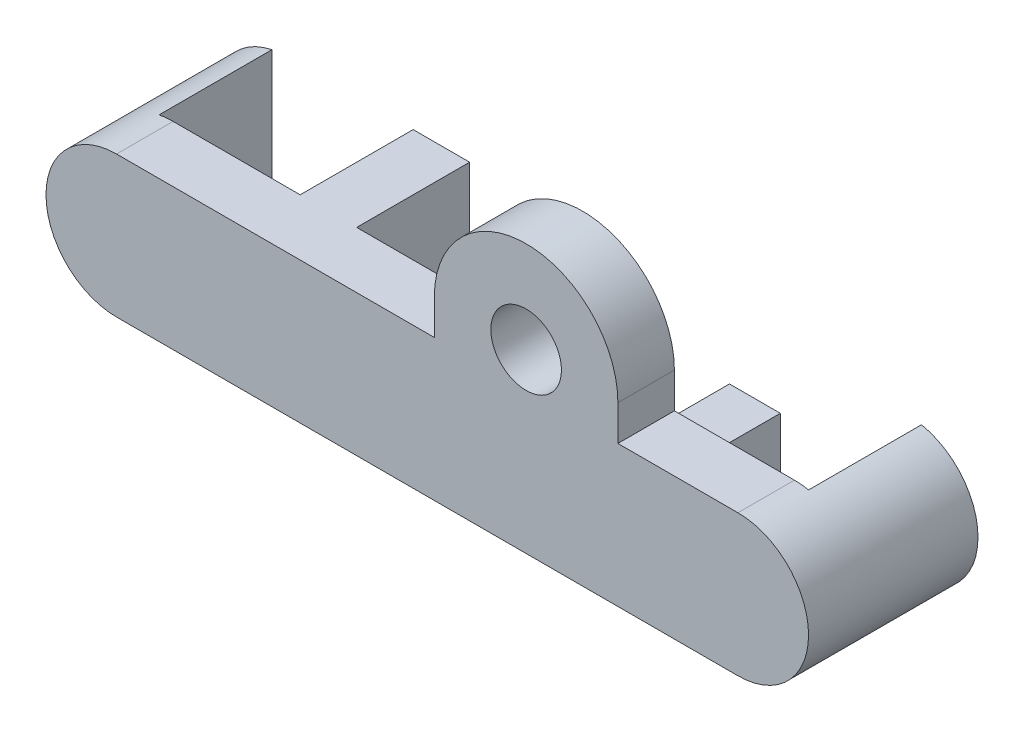
ISO-10303-21;
HEADER;
FILE_DESCRIPTION(('STEP AP214'),'2;1');
FILE_NAME('part.step','',(''),(''),'','','');
FILE_SCHEMA(('AUTOMOTIVE_DESIGN { 1 0 10303 214 1 1 1 1 }'));
ENDSEC;
DATA;
#1=APPLICATION_CONTEXT('core data for automotive mechanical design processes');
#2=APPLICATION_PROTOCOL_DEFINITION('international standard','automotive_design',2000,#1);
#3=PRODUCT_CONTEXT('',#1,'mechanical');
#4=PRODUCT('Part','Part','',(#3));
#5=PRODUCT_RELATED_PRODUCT_CATEGORY('part','',(#4));
#6=PRODUCT_DEFINITION_FORMATION('','',#4);
#7=PRODUCT_DEFINITION_CONTEXT('part definition',#1,'design');
#8=PRODUCT_DEFINITION('design','',#6,#7);
#9=PRODUCT_DEFINITION_SHAPE('','',#8);
#10=(LENGTH_UNIT() NAMED_UNIT(*) SI_UNIT(.MILLI.,.METRE.));
#11=(NAMED_UNIT(*) PLANE_ANGLE_UNIT() SI_UNIT($,.RADIAN.));
#12=(NAMED_UNIT(*) SI_UNIT($,.STERADIAN.) SOLID_ANGLE_UNIT());
#13=UNCERTAINTY_MEASURE_WITH_UNIT(LENGTH_MEASURE(1.E-05),#10,'distance_accuracy_value','');
#14=(GEOMETRIC_REPRESENTATION_CONTEXT(3) GLOBAL_UNCERTAINTY_ASSIGNED_CONTEXT((#13)) GLOBAL_UNIT_ASSIGNED_CONTEXT((#10,
#11,#12)) REPRESENTATION_CONTEXT('',''));
#15=CARTESIAN_POINT('',(0.,0.,0.));
#16=DIRECTION('',(0.,0.,1.));
#17=DIRECTION('',(1.,0.,0.));
#18=AXIS2_PLACEMENT_3D('',#15,#16,#17);
#19=CARTESIAN_POINT('',(-14.5,-3.75,-2.));
#20=DIRECTION('',(0.,0.,-1.));
#21=DIRECTION('',(1.,0.,0.));
#22=AXIS2_PLACEMENT_3D('',#19,#20,#21);
#23=PLANE('',#22);
#24=DIRECTION('',(1.,0.,0.));
#25=VECTOR('',#24,1.);
#26=CARTESIAN_POINT('',(-14.5,-6.25,-2.));
#27=LINE('',#26,#25);
#28=CARTESIAN_POINT('',(-14.5,-6.25,-2.));
#29=VERTEX_POINT('',#28);
#30=CARTESIAN_POINT('',(-10.,-6.25,-2.));
#31=VERTEX_POINT('',#30);
#32=EDGE_CURVE('E377',#29,#31,#27,.T.);
#33=ORIENTED_EDGE('',*,*,#32,.F.);
#34=CARTESIAN_POINT('',(-14.5,-3.75,-2.));
#35=DIRECTION('',(0.,0.,1.));
#36=DIRECTION('',(1.,0.,0.));
#37=AXIS2_PLACEMENT_3D('',#34,#35,#36);
#38=CIRCLE('',#37,2.5);
#39=CARTESIAN_POINT('',(-15.,-6.19948974278318,-2.));
#40=VERTEX_POINT('',#39);
#41=EDGE_CURVE('E376',#40,#29,#38,.T.);
#42=ORIENTED_EDGE('',*,*,#41,.F.);
#43=DIRECTION('',(0.,-1.,0.));
#44=VECTOR('',#43,1.);
#45=CARTESIAN_POINT('',(-15.,0.,-2.));
#46=LINE('',#45,#44);
#47=CARTESIAN_POINT('',(-15.,-1.30051025721682,-2.));
#48=VERTEX_POINT('',#47);
#49=EDGE_CURVE('E227',#48,#40,#46,.T.);
#50=ORIENTED_EDGE('',*,*,#49,.F.);
#51=CARTESIAN_POINT('',(-14.5,-1.25,-2.));
#52=VERTEX_POINT('',#51);
#53=EDGE_CURVE('E371',#52,#48,#38,.T.);
#54=ORIENTED_EDGE('',*,*,#53,.F.);
#55=DIRECTION('',(-1.,0.,0.));
#56=VECTOR('',#55,1.);
#57=CARTESIAN_POINT('',(-14.5,-1.25,-2.));
#58=LINE('',#57,#56);
#59=CARTESIAN_POINT('',(-10.,-1.25,-2.));
#60=VERTEX_POINT('',#59);
#61=EDGE_CURVE('E404',#60,#52,#58,.T.);
#62=ORIENTED_EDGE('',*,*,#61,.F.);
#63=DIRECTION('',(0.,-1.,0.));
#64=VECTOR('',#63,1.);
#65=CARTESIAN_POINT('',(-10.,0.,-2.));
#66=LINE('',#65,#64);
#67=EDGE_CURVE('E222',#60,#31,#66,.T.);
#68=ORIENTED_EDGE('',*,*,#67,.T.);
#69=EDGE_LOOP('',(#33,#42,#50,#54,#62,#68));
#70=FACE_BOUND('',#69,.T.);
#71=ADVANCED_FACE('F47',(#70),#23,.T.);
#72=DIRECTION('',(0.,-1.,0.));
#73=VECTOR('',#72,1.);
#74=CARTESIAN_POINT('',(-8.,0.,-2.));
#75=LINE('',#74,#73);
#76=CARTESIAN_POINT('',(-8.,-1.25,-2.));
#77=VERTEX_POINT('',#76);
#78=CARTESIAN_POINT('',(-8.,-6.25,-2.));
#79=VERTEX_POINT('',#78);
#80=EDGE_CURVE('E234',#77,#79,#75,.T.);
#81=ORIENTED_EDGE('',*,*,#80,.F.);
#82=CARTESIAN_POINT('',(-3.25,-1.25,-2.));
#83=VERTEX_POINT('',#82);
#84=EDGE_CURVE('E405',#83,#77,#58,.T.);
#85=ORIENTED_EDGE('',*,*,#84,.F.);
#86=DIRECTION('',(0.,-1.,0.));
#87=VECTOR('',#86,1.);
#88=CARTESIAN_POINT('',(-3.25,0.,-2.));
#89=LINE('',#88,#87);
#90=CARTESIAN_POINT('',(-3.25,0.,-2.));
#91=VERTEX_POINT('',#90);
#92=EDGE_CURVE('E400',#91,#83,#89,.T.);
#93=ORIENTED_EDGE('',*,*,#92,.F.);
#94=CARTESIAN_POINT('',(0.,0.,-2.));
#95=DIRECTION('',(0.,0.,1.));
#96=DIRECTION('',(1.,0.,0.));
#97=AXIS2_PLACEMENT_3D('',#94,#95,#96);
#98=CIRCLE('',#97,3.25);
#99=CARTESIAN_POINT('',(3.25,0.,-2.));
#100=VERTEX_POINT('',#99);
#101=EDGE_CURVE('E396',#100,#91,#98,.T.);
#102=ORIENTED_EDGE('',*,*,#101,.F.);
#103=DIRECTION('',(0.,1.,0.));
#104=VECTOR('',#103,1.);
#105=CARTESIAN_POINT('',(3.25,0.,-2.));
#106=LINE('',#105,#104);
#107=CARTESIAN_POINT('',(3.25,-1.25,-2.));
#108=VERTEX_POINT('',#107);
#109=EDGE_CURVE('E392',#108,#100,#106,.T.);
#110=ORIENTED_EDGE('',*,*,#109,.F.);
#111=DIRECTION('',(-1.,0.,0.));
#112=VECTOR('',#111,1.);
#113=CARTESIAN_POINT('',(3.25,-1.25,-2.));
#114=LINE('',#113,#112);
#115=CARTESIAN_POINT('',(7.5,-1.25,-2.));
#116=VERTEX_POINT('',#115);
#117=EDGE_CURVE('E388',#116,#108,#114,.T.);
#118=ORIENTED_EDGE('',*,*,#117,.F.);
#119=CARTESIAN_POINT('',(7.5,-3.75,-2.));
#120=DIRECTION('',(0.,0.,1.));
#121=DIRECTION('',(1.,0.,0.));
#122=AXIS2_PLACEMENT_3D('',#119,#120,#121);
#123=CIRCLE('',#122,2.5);
#124=CARTESIAN_POINT('',(8.,-1.30051025721682,-2.));
#125=VERTEX_POINT('',#124);
#126=EDGE_CURVE('E381',#125,#116,#123,.T.);
#127=ORIENTED_EDGE('',*,*,#126,.F.);
#128=DIRECTION('',(0.,-1.,0.));
#129=VECTOR('',#128,1.);
#130=CARTESIAN_POINT('',(8.,0.,-2.));
#131=LINE('',#130,#129);
#132=CARTESIAN_POINT('',(8.,-6.19948974278318,-2.));
#133=VERTEX_POINT('',#132);
#134=EDGE_CURVE('E270',#125,#133,#131,.T.);
#135=ORIENTED_EDGE('',*,*,#134,.T.);
#136=CARTESIAN_POINT('',(7.5,-6.25,-2.));
#137=VERTEX_POINT('',#136);
#138=EDGE_CURVE('E384',#137,#133,#123,.T.);
#139=ORIENTED_EDGE('',*,*,#138,.F.);
#140=CARTESIAN_POINT('',(3.,-6.25,-2.));
#141=VERTEX_POINT('',#140);
#142=EDGE_CURVE('E375',#141,#137,#27,.T.);
#143=ORIENTED_EDGE('',*,*,#142,.F.);
#144=DIRECTION('',(0.,-1.,0.));
#145=VECTOR('',#144,1.);
#146=CARTESIAN_POINT('',(3.,0.,-2.));
#147=LINE('',#146,#145);
#148=CARTESIAN_POINT('',(3.,-3.45,-2.));
#149=VERTEX_POINT('',#148);
#150=EDGE_CURVE('E293',#149,#141,#147,.T.);
#151=ORIENTED_EDGE('',*,*,#150,.F.);
#152=DIRECTION('',(1.,0.,0.));
#153=VECTOR('',#152,1.);
#154=CARTESIAN_POINT('',(0.,-3.45,-2.));
#155=LINE('',#154,#153);
#156=CARTESIAN_POINT('',(1.2,-3.45,-2.));
#157=VERTEX_POINT('',#156);
#158=EDGE_CURVE('E287',#157,#149,#155,.T.);
#159=ORIENTED_EDGE('',*,*,#158,.F.);
#160=DIRECTION('',(0.,-1.,0.));
#161=VECTOR('',#160,1.);
#162=CARTESIAN_POINT('',(1.2,0.,-2.));
#163=LINE('',#162,#161);
#164=CARTESIAN_POINT('',(1.2,-6.25,-2.));
#165=VERTEX_POINT('',#164);
#166=EDGE_CURVE('E307',#157,#165,#163,.T.);
#167=ORIENTED_EDGE('',*,*,#166,.T.);
#168=CARTESIAN_POINT('',(-1.2,-6.25,-2.));
#169=VERTEX_POINT('',#168);
#170=EDGE_CURVE('E383',#169,#165,#27,.T.);
#171=ORIENTED_EDGE('',*,*,#170,.F.);
#172=DIRECTION('',(0.,-1.,0.));
#173=VECTOR('',#172,1.);
#174=CARTESIAN_POINT('',(-1.2,0.,-2.));
#175=LINE('',#174,#173);
#176=CARTESIAN_POINT('',(-1.2,-3.45,-2.));
#177=VERTEX_POINT('',#176);
#178=EDGE_CURVE('E325',#177,#169,#175,.T.);
#179=ORIENTED_EDGE('',*,*,#178,.F.);
#180=DIRECTION('',(1.,0.,0.));
#181=VECTOR('',#180,1.);
#182=CARTESIAN_POINT('',(0.,-3.45,-2.));
#183=LINE('',#182,#181);
#184=CARTESIAN_POINT('',(-3.,-3.45,-2.));
#185=VERTEX_POINT('',#184);
#186=EDGE_CURVE('E344',#185,#177,#183,.T.);
#187=ORIENTED_EDGE('',*,*,#186,.F.);
#188=DIRECTION('',(0.,-1.,0.));
#189=VECTOR('',#188,1.);
#190=CARTESIAN_POINT('',(-3.,0.,-2.));
#191=LINE('',#190,#189);
#192=CARTESIAN_POINT('',(-3.,-6.25,-2.));
#193=VERTEX_POINT('',#192);
#194=EDGE_CURVE('E330',#185,#193,#191,.T.);
#195=ORIENTED_EDGE('',*,*,#194,.T.);
#196=EDGE_CURVE('E382',#79,#193,#27,.T.);
#197=ORIENTED_EDGE('',*,*,#196,.F.);
#198=EDGE_LOOP('',(#81,#85,#93,#102,#110,#118,#127,#135,#139,#143,#151,#159,#167,#171,#179,#187,
#195,#197));
#199=FACE_BOUND('',#198,.T.);
#200=CARTESIAN_POINT('',(0.,0.,-2.));
#201=DIRECTION('',(0.,0.,1.));
#202=DIRECTION('',(1.,0.,0.));
#203=AXIS2_PLACEMENT_3D('',#200,#201,#202);
#204=CIRCLE('',#203,1.25);
#205=CARTESIAN_POINT('',(1.25,0.,-2.));
#206=VERTEX_POINT('',#205);
#207=EDGE_CURVE('E363',#206,#206,#204,.T.);
#208=ORIENTED_EDGE('',*,*,#207,.T.);
#209=EDGE_LOOP('',(#208));
#210=FACE_BOUND('',#209,.T.);
#211=ADVANCED_FACE('F491',(#199,#210),#23,.T.);
#212=CARTESIAN_POINT('',(-14.5,-3.75,0.));
#213=DIRECTION('',(0.,0.,-1.));
#214=DIRECTION('',(1.,0.,0.));
#215=AXIS2_PLACEMENT_3D('',#212,#213,#214);
#216=PLANE('',#215);
#217=CARTESIAN_POINT('',(-14.5,-3.75,0.));
#218=DIRECTION('',(0.,0.,1.));
#219=DIRECTION('',(1.,0.,0.));
#220=AXIS2_PLACEMENT_3D('',#217,#218,#219);
#221=CIRCLE('',#220,2.5);
#222=CARTESIAN_POINT('',(-14.5,-1.25,0.));
#223=VERTEX_POINT('',#222);
#224=CARTESIAN_POINT('',(-14.5,-6.25,0.));
#225=VERTEX_POINT('',#224);
#226=EDGE_CURVE('E367',#223,#225,#221,.T.);
#227=ORIENTED_EDGE('',*,*,#226,.T.);
#228=DIRECTION('',(1.,0.,0.));
#229=VECTOR('',#228,1.);
#230=CARTESIAN_POINT('',(-14.5,-6.25,0.));
#231=LINE('',#230,#229);
#232=CARTESIAN_POINT('',(7.5,-6.25,0.));
#233=VERTEX_POINT('',#232);
#234=EDGE_CURVE('E412',#225,#233,#231,.T.);
#235=ORIENTED_EDGE('',*,*,#234,.T.);
#236=CARTESIAN_POINT('',(7.5,-3.75,0.));
#237=DIRECTION('',(0.,0.,1.));
#238=DIRECTION('',(1.,0.,0.));
#239=AXIS2_PLACEMENT_3D('',#236,#237,#238);
#240=CIRCLE('',#239,2.5);
#241=CARTESIAN_POINT('',(7.5,-1.25,0.));
#242=VERTEX_POINT('',#241);
#243=EDGE_CURVE('E416',#233,#242,#240,.T.);
#244=ORIENTED_EDGE('',*,*,#243,.T.);
#245=DIRECTION('',(-1.,0.,0.));
#246=VECTOR('',#245,1.);
#247=CARTESIAN_POINT('',(3.25,-1.25,0.));
#248=LINE('',#247,#246);
#249=CARTESIAN_POINT('',(3.25,-1.25,0.));
#250=VERTEX_POINT('',#249);
#251=EDGE_CURVE('E420',#242,#250,#248,.T.);
#252=ORIENTED_EDGE('',*,*,#251,.T.);
#253=DIRECTION('',(0.,1.,0.));
#254=VECTOR('',#253,1.);
#255=CARTESIAN_POINT('',(3.25,0.,0.));
#256=LINE('',#255,#254);
#257=CARTESIAN_POINT('',(3.25,0.,0.));
#258=VERTEX_POINT('',#257);
#259=EDGE_CURVE('E424',#250,#258,#256,.T.);
#260=ORIENTED_EDGE('',*,*,#259,.T.);
#261=CARTESIAN_POINT('',(0.,0.,0.));
#262=DIRECTION('',(0.,0.,1.));
#263=DIRECTION('',(1.,0.,0.));
#264=AXIS2_PLACEMENT_3D('',#261,#262,#263);
#265=CIRCLE('',#264,3.25);
#266=CARTESIAN_POINT('',(-3.25,0.,0.));
#267=VERTEX_POINT('',#266);
#268=EDGE_CURVE('E428',#258,#267,#265,.T.);
#269=ORIENTED_EDGE('',*,*,#268,.T.);
#270=DIRECTION('',(0.,-1.,0.));
#271=VECTOR('',#270,1.);
#272=CARTESIAN_POINT('',(-3.25,0.,0.));
#273=LINE('',#272,#271);
#274=CARTESIAN_POINT('',(-3.25,-1.25,0.));
#275=VERTEX_POINT('',#274);
#276=EDGE_CURVE('E431',#267,#275,#273,.T.);
#277=ORIENTED_EDGE('',*,*,#276,.T.);
#278=DIRECTION('',(-1.,0.,0.));
#279=VECTOR('',#278,1.);
#280=CARTESIAN_POINT('',(-14.5,-1.25,0.));
#281=LINE('',#280,#279);
#282=EDGE_CURVE('E435',#275,#223,#281,.T.);
#283=ORIENTED_EDGE('',*,*,#282,.T.);
#284=EDGE_LOOP('',(#227,#235,#244,#252,#260,#269,#277,#283));
#285=FACE_BOUND('',#284,.T.);
#286=CARTESIAN_POINT('',(0.,0.,0.));
#287=DIRECTION('',(0.,0.,1.));
#288=DIRECTION('',(1.,0.,0.));
#289=AXIS2_PLACEMENT_3D('',#286,#287,#288);
#290=CIRCLE('',#289,1.25);
#291=CARTESIAN_POINT('',(1.25,0.,0.));
#292=VERTEX_POINT('',#291);
#293=EDGE_CURVE('E362',#292,#292,#290,.T.);
#294=ORIENTED_EDGE('',*,*,#293,.F.);
#295=EDGE_LOOP('',(#294));
#296=FACE_BOUND('',#295,.T.);
#297=ADVANCED_FACE('F467',(#285,#296),#216,.F.);
#298=CARTESIAN_POINT('',(-14.5,-3.75,-2.));
#299=DIRECTION('',(0.,0.,1.));
#300=DIRECTION('',(-1.,0.,0.));
#301=AXIS2_PLACEMENT_3D('',#298,#299,#300);
#302=CYLINDRICAL_SURFACE('',#301,2.5);
#303=ORIENTED_EDGE('',*,*,#226,.F.);
#304=DIRECTION('',(0.,0.,1.));
#305=VECTOR('',#304,1.);
#306=CARTESIAN_POINT('',(-14.5,-1.25,-2.));
#307=LINE('',#306,#305);
#308=EDGE_CURVE('E408',#52,#223,#307,.T.);
#309=ORIENTED_EDGE('',*,*,#308,.F.);
#310=ORIENTED_EDGE('',*,*,#53,.T.);
#311=DIRECTION('',(0.,0.,1.));
#312=VECTOR('',#311,1.);
#313=CARTESIAN_POINT('',(-15.,-1.30051025721682,-6.));
#314=LINE('',#313,#312);
#315=CARTESIAN_POINT('',(-15.,-1.30051025721682,-6.));
#316=VERTEX_POINT('',#315);
#317=EDGE_CURVE('E267',#316,#48,#314,.T.);
#318=ORIENTED_EDGE('',*,*,#317,.F.);
#319=CARTESIAN_POINT('',(-14.5,-3.75,-6.));
#320=DIRECTION('',(0.,0.,1.));
#321=DIRECTION('',(1.,0.,0.));
#322=AXIS2_PLACEMENT_3D('',#319,#320,#321);
#323=CIRCLE('',#322,2.5);
#324=CARTESIAN_POINT('',(-15.,-6.19948974278318,-6.));
#325=VERTEX_POINT('',#324);
#326=EDGE_CURVE('E257',#316,#325,#323,.T.);
#327=ORIENTED_EDGE('',*,*,#326,.T.);
#328=DIRECTION('',(0.,0.,1.));
#329=VECTOR('',#328,1.);
#330=CARTESIAN_POINT('',(-15.,-6.19948974278318,-6.));
#331=LINE('',#330,#329);
#332=EDGE_CURVE('E261',#325,#40,#331,.T.);
#333=ORIENTED_EDGE('',*,*,#332,.T.);
#334=ORIENTED_EDGE('',*,*,#41,.T.);
#335=DIRECTION('',(0.,0.,1.));
#336=VECTOR('',#335,1.);
#337=CARTESIAN_POINT('',(-14.5,-6.25,-2.));
#338=LINE('',#337,#336);
#339=EDGE_CURVE('E11',#29,#225,#338,.T.);
#340=ORIENTED_EDGE('',*,*,#339,.T.);
#341=EDGE_LOOP('',(#303,#309,#310,#318,#327,#333,#334,#340));
#342=FACE_BOUND('',#341,.T.);
#343=ADVANCED_FACE('F49',(#342),#302,.T.);
#344=CARTESIAN_POINT('',(-14.5,-6.25,-2.));
#345=DIRECTION('',(0.,1.,0.));
#346=DIRECTION('',(0.,0.,-1.));
#347=AXIS2_PLACEMENT_3D('',#344,#345,#346);
#348=PLANE('',#347);
#349=ORIENTED_EDGE('',*,*,#234,.F.);
#350=ORIENTED_EDGE('',*,*,#339,.F.);
#351=ORIENTED_EDGE('',*,*,#32,.T.);
#352=DIRECTION('',(0.,0.,1.));
#353=VECTOR('',#352,1.);
#354=CARTESIAN_POINT('',(-10.,-6.25,-6.));
#355=LINE('',#354,#353);
#356=CARTESIAN_POINT('',(-10.,-6.25,-6.));
#357=VERTEX_POINT('',#356);
#358=EDGE_CURVE('E71',#357,#31,#355,.T.);
#359=ORIENTED_EDGE('',*,*,#358,.F.);
#360=DIRECTION('',(1.,0.,0.));
#361=VECTOR('',#360,1.);
#362=CARTESIAN_POINT('',(0.,-6.25,-6.));
#363=LINE('',#362,#361);
#364=CARTESIAN_POINT('',(-8.,-6.25,-6.));
#365=VERTEX_POINT('',#364);
#366=EDGE_CURVE('E217',#357,#365,#363,.T.);
#367=ORIENTED_EDGE('',*,*,#366,.T.);
#368=DIRECTION('',(0.,0.,1.));
#369=VECTOR('',#368,1.);
#370=CARTESIAN_POINT('',(-8.,-6.25,-6.));
#371=LINE('',#370,#369);
#372=EDGE_CURVE('E63',#365,#79,#371,.T.);
#373=ORIENTED_EDGE('',*,*,#372,.T.);
#374=ORIENTED_EDGE('',*,*,#196,.T.);
#375=DIRECTION('',(0.,0.,1.));
#376=VECTOR('',#375,1.);
#377=CARTESIAN_POINT('',(-3.,-6.25,-6.));
#378=LINE('',#377,#376);
#379=CARTESIAN_POINT('',(-3.,-6.25,-6.));
#380=VERTEX_POINT('',#379);
#381=EDGE_CURVE('E353',#380,#193,#378,.T.);
#382=ORIENTED_EDGE('',*,*,#381,.F.);
#383=DIRECTION('',(1.,0.,0.));
#384=VECTOR('',#383,1.);
#385=CARTESIAN_POINT('',(0.,-6.25,-6.));
#386=LINE('',#385,#384);
#387=CARTESIAN_POINT('',(-1.2,-6.25,-6.));
#388=VERTEX_POINT('',#387);
#389=EDGE_CURVE('E336',#380,#388,#386,.T.);
#390=ORIENTED_EDGE('',*,*,#389,.T.);
#391=DIRECTION('',(0.,0.,1.));
#392=VECTOR('',#391,1.);
#393=CARTESIAN_POINT('',(-1.2,-6.25,-6.));
#394=LINE('',#393,#392);
#395=EDGE_CURVE('E340',#388,#169,#394,.T.);
#396=ORIENTED_EDGE('',*,*,#395,.T.);
#397=ORIENTED_EDGE('',*,*,#170,.T.);
#398=DIRECTION('',(0.,0.,1.));
#399=VECTOR('',#398,1.);
#400=CARTESIAN_POINT('',(1.2,-6.25,-6.));
#401=LINE('',#400,#399);
#402=CARTESIAN_POINT('',(1.2,-6.25,-6.));
#403=VERTEX_POINT('',#402);
#404=EDGE_CURVE('E319',#403,#165,#401,.T.);
#405=ORIENTED_EDGE('',*,*,#404,.F.);
#406=DIRECTION('',(1.,0.,0.));
#407=VECTOR('',#406,1.);
#408=CARTESIAN_POINT('',(0.,-6.25,-6.));
#409=LINE('',#408,#407);
#410=CARTESIAN_POINT('',(3.,-6.25,-6.));
#411=VERTEX_POINT('',#410);
#412=EDGE_CURVE('E296',#403,#411,#409,.T.);
#413=ORIENTED_EDGE('',*,*,#412,.T.);
#414=DIRECTION('',(0.,0.,1.));
#415=VECTOR('',#414,1.);
#416=CARTESIAN_POINT('',(3.,-6.25,-6.));
#417=LINE('',#416,#415);
#418=EDGE_CURVE('E316',#411,#141,#417,.T.);
#419=ORIENTED_EDGE('',*,*,#418,.T.);
#420=ORIENTED_EDGE('',*,*,#142,.T.);
#421=DIRECTION('',(0.,0.,1.));
#422=VECTOR('',#421,1.);
#423=CARTESIAN_POINT('',(7.5,-6.25,-2.));
#424=LINE('',#423,#422);
#425=EDGE_CURVE('E56',#137,#233,#424,.T.);
#426=ORIENTED_EDGE('',*,*,#425,.T.);
#427=EDGE_LOOP('',(#349,#350,#351,#359,#367,#373,#374,#382,#390,#396,#397,#405,#413,#419,#420,#426));
#428=FACE_BOUND('',#427,.T.);
#429=ADVANCED_FACE('F459',(#428),#348,.F.);
#430=CARTESIAN_POINT('',(7.5,-3.75,-2.));
#431=DIRECTION('',(0.,0.,1.));
#432=DIRECTION('',(-1.,0.,0.));
#433=AXIS2_PLACEMENT_3D('',#430,#431,#432);
#434=CYLINDRICAL_SURFACE('',#433,2.5);
#435=ORIENTED_EDGE('',*,*,#243,.F.);
#436=ORIENTED_EDGE('',*,*,#425,.F.);
#437=ORIENTED_EDGE('',*,*,#138,.T.);
#438=DIRECTION('',(0.,0.,1.));
#439=VECTOR('',#438,1.);
#440=CARTESIAN_POINT('',(8.,-6.19948974278318,-6.));
#441=LINE('',#440,#439);
#442=CARTESIAN_POINT('',(8.,-6.19948974278318,-6.));
#443=VERTEX_POINT('',#442);
#444=EDGE_CURVE('E278',#443,#133,#441,.T.);
#445=ORIENTED_EDGE('',*,*,#444,.F.);
#446=CARTESIAN_POINT('',(7.5,-3.75,-6.));
#447=DIRECTION('',(0.,0.,1.));
#448=DIRECTION('',(1.,0.,0.));
#449=AXIS2_PLACEMENT_3D('',#446,#447,#448);
#450=CIRCLE('',#449,2.5);
#451=CARTESIAN_POINT('',(8.,-1.30051025721682,-6.));
#452=VERTEX_POINT('',#451);
#453=EDGE_CURVE('E271',#443,#452,#450,.T.);
#454=ORIENTED_EDGE('',*,*,#453,.T.);
#455=DIRECTION('',(0.,0.,1.));
#456=VECTOR('',#455,1.);
#457=CARTESIAN_POINT('',(8.,-1.30051025721682,-6.));
#458=LINE('',#457,#456);
#459=EDGE_CURVE('E284',#452,#125,#458,.T.);
#460=ORIENTED_EDGE('',*,*,#459,.T.);
#461=ORIENTED_EDGE('',*,*,#126,.T.);
#462=DIRECTION('',(0.,0.,1.));
#463=VECTOR('',#462,1.);
#464=CARTESIAN_POINT('',(7.5,-1.25,-2.));
#465=LINE('',#464,#463);
#466=EDGE_CURVE('E453',#116,#242,#465,.T.);
#467=ORIENTED_EDGE('',*,*,#466,.T.);
#468=EDGE_LOOP('',(#435,#436,#437,#445,#454,#460,#461,#467));
#469=FACE_BOUND('',#468,.T.);
#470=ADVANCED_FACE('F463',(#469),#434,.T.);
#471=CARTESIAN_POINT('',(3.25,-1.25,-2.));
#472=DIRECTION('',(0.,-1.,0.));
#473=DIRECTION('',(0.,0.,1.));
#474=AXIS2_PLACEMENT_3D('',#471,#472,#473);
#475=PLANE('',#474);
#476=ORIENTED_EDGE('',*,*,#251,.F.);
#477=ORIENTED_EDGE('',*,*,#466,.F.);
#478=ORIENTED_EDGE('',*,*,#117,.T.);
#479=DIRECTION('',(0.,0.,1.));
#480=VECTOR('',#479,1.);
#481=CARTESIAN_POINT('',(3.25,-1.25,-2.));
#482=LINE('',#481,#480);
#483=EDGE_CURVE('E450',#108,#250,#482,.T.);
#484=ORIENTED_EDGE('',*,*,#483,.T.);
#485=EDGE_LOOP('',(#476,#477,#478,#484));
#486=FACE_BOUND('',#485,.T.);
#487=ADVANCED_FACE('F549',(#486),#475,.F.);
#488=CARTESIAN_POINT('',(3.25,0.,-2.));
#489=DIRECTION('',(-1.,0.,0.));
#490=DIRECTION('',(0.,0.,-1.));
#491=AXIS2_PLACEMENT_3D('',#488,#489,#490);
#492=PLANE('',#491);
#493=ORIENTED_EDGE('',*,*,#259,.F.);
#494=ORIENTED_EDGE('',*,*,#483,.F.);
#495=ORIENTED_EDGE('',*,*,#109,.T.);
#496=DIRECTION('',(0.,0.,1.));
#497=VECTOR('',#496,1.);
#498=CARTESIAN_POINT('',(3.25,0.,-2.));
#499=LINE('',#498,#497);
#500=EDGE_CURVE('E447',#100,#258,#499,.T.);
#501=ORIENTED_EDGE('',*,*,#500,.T.);
#502=EDGE_LOOP('',(#493,#494,#495,#501));
#503=FACE_BOUND('',#502,.T.);
#504=ADVANCED_FACE('F545',(#503),#492,.F.);
#505=CARTESIAN_POINT('',(0.,0.,-2.));
#506=DIRECTION('',(0.,0.,1.));
#507=DIRECTION('',(-1.,0.,0.));
#508=AXIS2_PLACEMENT_3D('',#505,#506,#507);
#509=CYLINDRICAL_SURFACE('',#508,3.25);
#510=ORIENTED_EDGE('',*,*,#268,.F.);
#511=ORIENTED_EDGE('',*,*,#500,.F.);
#512=ORIENTED_EDGE('',*,*,#101,.T.);
#513=DIRECTION('',(0.,0.,1.));
#514=VECTOR('',#513,1.);
#515=CARTESIAN_POINT('',(-3.25,0.,-2.));
#516=LINE('',#515,#514);
#517=EDGE_CURVE('E444',#91,#267,#516,.T.);
#518=ORIENTED_EDGE('',*,*,#517,.T.);
#519=EDGE_LOOP('',(#510,#511,#512,#518));
#520=FACE_BOUND('',#519,.T.);
#521=ADVANCED_FACE('F541',(#520),#509,.T.);
#522=CARTESIAN_POINT('',(-3.25,0.,-2.));
#523=DIRECTION('',(1.,0.,0.));
#524=DIRECTION('',(0.,0.,1.));
#525=AXIS2_PLACEMENT_3D('',#522,#523,#524);
#526=PLANE('',#525);
#527=ORIENTED_EDGE('',*,*,#276,.F.);
#528=ORIENTED_EDGE('',*,*,#517,.F.);
#529=ORIENTED_EDGE('',*,*,#92,.T.);
#530=DIRECTION('',(0.,0.,1.));
#531=VECTOR('',#530,1.);
#532=CARTESIAN_POINT('',(-3.25,-1.25,-2.));
#533=LINE('',#532,#531);
#534=EDGE_CURVE('E441',#83,#275,#533,.T.);
#535=ORIENTED_EDGE('',*,*,#534,.T.);
#536=EDGE_LOOP('',(#527,#528,#529,#535));
#537=FACE_BOUND('',#536,.T.);
#538=ADVANCED_FACE('F538',(#537),#526,.F.);
#539=CARTESIAN_POINT('',(-14.5,-1.25,-2.));
#540=DIRECTION('',(0.,-1.,0.));
#541=DIRECTION('',(0.,0.,1.));
#542=AXIS2_PLACEMENT_3D('',#539,#540,#541);
#543=PLANE('',#542);
#544=ORIENTED_EDGE('',*,*,#282,.F.);
#545=ORIENTED_EDGE('',*,*,#534,.F.);
#546=ORIENTED_EDGE('',*,*,#84,.T.);
#547=DIRECTION('',(0.,0.,1.));
#548=VECTOR('',#547,1.);
#549=CARTESIAN_POINT('',(-8.,-1.25,-6.));
#550=LINE('',#549,#548);
#551=CARTESIAN_POINT('',(-8.,-1.25,-6.));
#552=VERTEX_POINT('',#551);
#553=EDGE_CURVE('E232',#552,#77,#550,.T.);
#554=ORIENTED_EDGE('',*,*,#553,.F.);
#555=DIRECTION('',(-1.,0.,0.));
#556=VECTOR('',#555,1.);
#557=CARTESIAN_POINT('',(0.,-1.25,-6.));
#558=LINE('',#557,#556);
#559=CARTESIAN_POINT('',(-10.,-1.25,-6.));
#560=VERTEX_POINT('',#559);
#561=EDGE_CURVE('E215',#552,#560,#558,.T.);
#562=ORIENTED_EDGE('',*,*,#561,.T.);
#563=DIRECTION('',(0.,0.,1.));
#564=VECTOR('',#563,1.);
#565=CARTESIAN_POINT('',(-10.,-1.25,-6.));
#566=LINE('',#565,#564);
#567=EDGE_CURVE('E220',#560,#60,#566,.T.);
#568=ORIENTED_EDGE('',*,*,#567,.T.);
#569=ORIENTED_EDGE('',*,*,#61,.T.);
#570=ORIENTED_EDGE('',*,*,#308,.T.);
#571=EDGE_LOOP('',(#544,#545,#546,#554,#562,#568,#569,#570));
#572=FACE_BOUND('',#571,.T.);
#573=ADVANCED_FACE('F230',(#572),#543,.F.);
#574=CARTESIAN_POINT('',(0.,0.,-2.));
#575=DIRECTION('',(0.,0.,1.));
#576=DIRECTION('',(-1.,0.,0.));
#577=AXIS2_PLACEMENT_3D('',#574,#575,#576);
#578=CYLINDRICAL_SURFACE('',#577,1.25);
#579=ORIENTED_EDGE('',*,*,#207,.F.);
#580=EDGE_LOOP('',(#579));
#581=FACE_BOUND('',#580,.T.);
#582=ORIENTED_EDGE('',*,*,#293,.T.);
#583=EDGE_LOOP('',(#582));
#584=FACE_BOUND('',#583,.T.);
#585=ADVANCED_FACE('F532',(#581,#584),#578,.F.);
#586=CARTESIAN_POINT('',(-1.2,0.,-6.));
#587=DIRECTION('',(1.,0.,0.));
#588=DIRECTION('',(0.,1.,0.));
#589=AXIS2_PLACEMENT_3D('',#586,#587,#588);
#590=PLANE('',#589);
#591=ORIENTED_EDGE('',*,*,#178,.T.);
#592=ORIENTED_EDGE('',*,*,#395,.F.);
#593=DIRECTION('',(0.,-1.,0.));
#594=VECTOR('',#593,1.);
#595=CARTESIAN_POINT('',(-1.2,0.,-6.));
#596=LINE('',#595,#594);
#597=CARTESIAN_POINT('',(-1.2,-3.45,-6.));
#598=VERTEX_POINT('',#597);
#599=EDGE_CURVE('E326',#598,#388,#596,.T.);
#600=ORIENTED_EDGE('',*,*,#599,.F.);
#601=DIRECTION('',(0.,0.,1.));
#602=VECTOR('',#601,1.);
#603=CARTESIAN_POINT('',(-1.2,-3.45,-6.));
#604=LINE('',#603,#602);
#605=EDGE_CURVE('E359',#598,#177,#604,.T.);
#606=ORIENTED_EDGE('',*,*,#605,.T.);
#607=EDGE_LOOP('',(#591,#592,#600,#606));
#608=FACE_BOUND('',#607,.T.);
#609=ADVANCED_FACE('F693',(#608),#590,.T.);
#610=CARTESIAN_POINT('',(0.,-3.45,-6.));
#611=DIRECTION('',(0.,1.,0.));
#612=DIRECTION('',(-1.,0.,0.));
#613=AXIS2_PLACEMENT_3D('',#610,#611,#612);
#614=PLANE('',#613);
#615=ORIENTED_EDGE('',*,*,#186,.T.);
#616=ORIENTED_EDGE('',*,*,#605,.F.);
#617=DIRECTION('',(1.,0.,0.));
#618=VECTOR('',#617,1.);
#619=CARTESIAN_POINT('',(0.,-3.45,-6.));
#620=LINE('',#619,#618);
#621=CARTESIAN_POINT('',(-3.,-3.45,-6.));
#622=VERTEX_POINT('',#621);
#623=EDGE_CURVE('E329',#622,#598,#620,.T.);
#624=ORIENTED_EDGE('',*,*,#623,.F.);
#625=DIRECTION('',(0.,0.,1.));
#626=VECTOR('',#625,1.);
#627=CARTESIAN_POINT('',(-3.,-3.45,-6.));
#628=LINE('',#627,#626);
#629=EDGE_CURVE('E356',#622,#185,#628,.T.);
#630=ORIENTED_EDGE('',*,*,#629,.T.);
#631=EDGE_LOOP('',(#615,#616,#624,#630));
#632=FACE_BOUND('',#631,.T.);
#633=ADVANCED_FACE('F705',(#632),#614,.T.);
#634=CARTESIAN_POINT('',(-3.,0.,-6.));
#635=DIRECTION('',(1.,0.,0.));
#636=DIRECTION('',(0.,0.,1.));
#637=AXIS2_PLACEMENT_3D('',#634,#635,#636);
#638=PLANE('',#637);
#639=ORIENTED_EDGE('',*,*,#194,.F.);
#640=ORIENTED_EDGE('',*,*,#629,.F.);
#641=DIRECTION('',(0.,-1.,0.));
#642=VECTOR('',#641,1.);
#643=CARTESIAN_POINT('',(-3.,0.,-6.));
#644=LINE('',#643,#642);
#645=EDGE_CURVE('E333',#622,#380,#644,.T.);
#646=ORIENTED_EDGE('',*,*,#645,.T.);
#647=ORIENTED_EDGE('',*,*,#381,.T.);
#648=EDGE_LOOP('',(#639,#640,#646,#647));
#649=FACE_BOUND('',#648,.T.);
#650=ADVANCED_FACE('F716',(#649),#638,.F.);
#651=CARTESIAN_POINT('',(0.,0.,-6.));
#652=DIRECTION('',(0.,0.,-1.));
#653=DIRECTION('',(1.,0.,0.));
#654=AXIS2_PLACEMENT_3D('',#651,#652,#653);
#655=PLANE('',#654);
#656=ORIENTED_EDGE('',*,*,#599,.T.);
#657=ORIENTED_EDGE('',*,*,#389,.F.);
#658=ORIENTED_EDGE('',*,*,#645,.F.);
#659=ORIENTED_EDGE('',*,*,#623,.T.);
#660=EDGE_LOOP('',(#656,#657,#658,#659));
#661=FACE_BOUND('',#660,.T.);
#662=ADVANCED_FACE('F728',(#661),#655,.T.);
#663=CARTESIAN_POINT('',(0.,-3.45,-6.));
#664=DIRECTION('',(0.,1.,0.));
#665=DIRECTION('',(-1.,0.,0.));
#666=AXIS2_PLACEMENT_3D('',#663,#664,#665);
#667=PLANE('',#666);
#668=ORIENTED_EDGE('',*,*,#158,.T.);
#669=DIRECTION('',(0.,0.,1.));
#670=VECTOR('',#669,1.);
#671=CARTESIAN_POINT('',(3.,-3.45,-6.));
#672=LINE('',#671,#670);
#673=CARTESIAN_POINT('',(3.,-3.45,-6.));
#674=VERTEX_POINT('',#673);
#675=EDGE_CURVE('E303',#674,#149,#672,.T.);
#676=ORIENTED_EDGE('',*,*,#675,.F.);
#677=DIRECTION('',(1.,0.,0.));
#678=VECTOR('',#677,1.);
#679=CARTESIAN_POINT('',(0.,-3.45,-6.));
#680=LINE('',#679,#678);
#681=CARTESIAN_POINT('',(1.2,-3.45,-6.));
#682=VERTEX_POINT('',#681);
#683=EDGE_CURVE('E288',#682,#674,#680,.T.);
#684=ORIENTED_EDGE('',*,*,#683,.F.);
#685=DIRECTION('',(0.,0.,1.));
#686=VECTOR('',#685,1.);
#687=CARTESIAN_POINT('',(1.2,-3.45,-6.));
#688=LINE('',#687,#686);
#689=EDGE_CURVE('E322',#682,#157,#688,.T.);
#690=ORIENTED_EDGE('',*,*,#689,.T.);
#691=EDGE_LOOP('',(#668,#676,#684,#690));
#692=FACE_BOUND('',#691,.T.);
#693=ADVANCED_FACE('F739',(#692),#667,.T.);
#694=CARTESIAN_POINT('',(1.2,0.,-6.));
#695=DIRECTION('',(1.,0.,0.));
#696=DIRECTION('',(0.,1.,0.));
#697=AXIS2_PLACEMENT_3D('',#694,#695,#696);
#698=PLANE('',#697);
#699=ORIENTED_EDGE('',*,*,#166,.F.);
#700=ORIENTED_EDGE('',*,*,#689,.F.);
#701=DIRECTION('',(0.,-1.,0.));
#702=VECTOR('',#701,1.);
#703=CARTESIAN_POINT('',(1.2,0.,-6.));
#704=LINE('',#703,#702);
#705=EDGE_CURVE('E292',#682,#403,#704,.T.);
#706=ORIENTED_EDGE('',*,*,#705,.T.);
#707=ORIENTED_EDGE('',*,*,#404,.T.);
#708=EDGE_LOOP('',(#699,#700,#706,#707));
#709=FACE_BOUND('',#708,.T.);
#710=ADVANCED_FACE('F496',(#709),#698,.F.);
#711=CARTESIAN_POINT('',(3.,0.,-6.));
#712=DIRECTION('',(1.,0.,0.));
#713=DIRECTION('',(0.,1.,0.));
#714=AXIS2_PLACEMENT_3D('',#711,#712,#713);
#715=PLANE('',#714);
#716=ORIENTED_EDGE('',*,*,#150,.T.);
#717=ORIENTED_EDGE('',*,*,#418,.F.);
#718=DIRECTION('',(0.,-1.,0.));
#719=VECTOR('',#718,1.);
#720=CARTESIAN_POINT('',(3.,0.,-6.));
#721=LINE('',#720,#719);
#722=EDGE_CURVE('E300',#674,#411,#721,.T.);
#723=ORIENTED_EDGE('',*,*,#722,.F.);
#724=ORIENTED_EDGE('',*,*,#675,.T.);
#725=EDGE_LOOP('',(#716,#717,#723,#724));
#726=FACE_BOUND('',#725,.T.);
#727=ADVANCED_FACE('F503',(#726),#715,.T.);
#728=CARTESIAN_POINT('',(0.,0.,-6.));
#729=DIRECTION('',(0.,0.,-1.));
#730=DIRECTION('',(1.,0.,0.));
#731=AXIS2_PLACEMENT_3D('',#728,#729,#730);
#732=PLANE('',#731);
#733=ORIENTED_EDGE('',*,*,#683,.T.);
#734=ORIENTED_EDGE('',*,*,#722,.T.);
#735=ORIENTED_EDGE('',*,*,#412,.F.);
#736=ORIENTED_EDGE('',*,*,#705,.F.);
#737=EDGE_LOOP('',(#733,#734,#735,#736));
#738=FACE_BOUND('',#737,.T.);
#739=ADVANCED_FACE('F500',(#738),#732,.T.);
#740=CARTESIAN_POINT('',(8.,0.,-6.));
#741=DIRECTION('',(1.,0.,0.));
#742=DIRECTION('',(0.,0.,1.));
#743=AXIS2_PLACEMENT_3D('',#740,#741,#742);
#744=PLANE('',#743);
#745=ORIENTED_EDGE('',*,*,#134,.F.);
#746=ORIENTED_EDGE('',*,*,#459,.F.);
#747=DIRECTION('',(0.,-1.,0.));
#748=VECTOR('',#747,1.);
#749=CARTESIAN_POINT('',(8.,0.,-6.));
#750=LINE('',#749,#748);
#751=EDGE_CURVE('E275',#452,#443,#750,.T.);
#752=ORIENTED_EDGE('',*,*,#751,.T.);
#753=ORIENTED_EDGE('',*,*,#444,.T.);
#754=EDGE_LOOP('',(#745,#746,#752,#753));
#755=FACE_BOUND('',#754,.T.);
#756=ADVANCED_FACE('F510',(#755),#744,.F.);
#757=CARTESIAN_POINT('',(0.,0.,-6.));
#758=DIRECTION('',(0.,0.,-1.));
#759=DIRECTION('',(1.,0.,0.));
#760=AXIS2_PLACEMENT_3D('',#757,#758,#759);
#761=PLANE('',#760);
#762=ORIENTED_EDGE('',*,*,#453,.F.);
#763=ORIENTED_EDGE('',*,*,#751,.F.);
#764=EDGE_LOOP('',(#762,#763));
#765=FACE_BOUND('',#764,.T.);
#766=ADVANCED_FACE('F513',(#765),#761,.T.);
#767=CARTESIAN_POINT('',(-15.,0.,-6.));
#768=DIRECTION('',(1.,0.,0.));
#769=DIRECTION('',(0.,1.,0.));
#770=AXIS2_PLACEMENT_3D('',#767,#768,#769);
#771=PLANE('',#770);
#772=ORIENTED_EDGE('',*,*,#49,.T.);
#773=ORIENTED_EDGE('',*,*,#332,.F.);
#774=DIRECTION('',(0.,-1.,0.));
#775=VECTOR('',#774,1.);
#776=CARTESIAN_POINT('',(-15.,0.,-6.));
#777=LINE('',#776,#775);
#778=EDGE_CURVE('E254',#316,#325,#777,.T.);
#779=ORIENTED_EDGE('',*,*,#778,.F.);
#780=ORIENTED_EDGE('',*,*,#317,.T.);
#781=EDGE_LOOP('',(#772,#773,#779,#780));
#782=FACE_BOUND('',#781,.T.);
#783=ADVANCED_FACE('F515',(#782),#771,.T.);
#784=CARTESIAN_POINT('',(0.,0.,-6.));
#785=DIRECTION('',(0.,0.,-1.));
#786=DIRECTION('',(1.,0.,0.));
#787=AXIS2_PLACEMENT_3D('',#784,#785,#786);
#788=PLANE('',#787);
#789=ORIENTED_EDGE('',*,*,#778,.T.);
#790=ORIENTED_EDGE('',*,*,#326,.F.);
#791=EDGE_LOOP('',(#789,#790));
#792=FACE_BOUND('',#791,.T.);
#793=ADVANCED_FACE('F521',(#792),#788,.T.);
#794=CARTESIAN_POINT('',(-10.,0.,-6.));
#795=DIRECTION('',(1.,0.,0.));
#796=DIRECTION('',(0.,1.,0.));
#797=AXIS2_PLACEMENT_3D('',#794,#795,#796);
#798=PLANE('',#797);
#799=ORIENTED_EDGE('',*,*,#67,.F.);
#800=ORIENTED_EDGE('',*,*,#567,.F.);
#801=DIRECTION('',(0.,-1.,0.));
#802=VECTOR('',#801,1.);
#803=CARTESIAN_POINT('',(-10.,0.,-6.));
#804=LINE('',#803,#802);
#805=EDGE_CURVE('E211',#560,#357,#804,.T.);
#806=ORIENTED_EDGE('',*,*,#805,.T.);
#807=ORIENTED_EDGE('',*,*,#358,.T.);
#808=EDGE_LOOP('',(#799,#800,#806,#807));
#809=FACE_BOUND('',#808,.T.);
#810=ADVANCED_FACE('F221',(#809),#798,.F.);
#811=CARTESIAN_POINT('',(-8.,0.,-6.));
#812=DIRECTION('',(1.,0.,0.));
#813=DIRECTION('',(0.,0.,1.));
#814=AXIS2_PLACEMENT_3D('',#811,#812,#813);
#815=PLANE('',#814);
#816=ORIENTED_EDGE('',*,*,#80,.T.);
#817=ORIENTED_EDGE('',*,*,#372,.F.);
#818=DIRECTION('',(0.,-1.,0.));
#819=VECTOR('',#818,1.);
#820=CARTESIAN_POINT('',(-8.,0.,-6.));
#821=LINE('',#820,#819);
#822=EDGE_CURVE('E243',#552,#365,#821,.T.);
#823=ORIENTED_EDGE('',*,*,#822,.F.);
#824=ORIENTED_EDGE('',*,*,#553,.T.);
#825=EDGE_LOOP('',(#816,#817,#823,#824));
#826=FACE_BOUND('',#825,.T.);
#827=ADVANCED_FACE('F824',(#826),#815,.T.);
#828=CARTESIAN_POINT('',(0.,0.,-6.));
#829=DIRECTION('',(0.,0.,-1.));
#830=DIRECTION('',(1.,0.,0.));
#831=AXIS2_PLACEMENT_3D('',#828,#829,#830);
#832=PLANE('',#831);
#833=ORIENTED_EDGE('',*,*,#561,.F.);
#834=ORIENTED_EDGE('',*,*,#822,.T.);
#835=ORIENTED_EDGE('',*,*,#366,.F.);
#836=ORIENTED_EDGE('',*,*,#805,.F.);
#837=EDGE_LOOP('',(#833,#834,#835,#836));
#838=FACE_BOUND('',#837,.T.);
#839=ADVANCED_FACE('F213',(#838),#832,.T.);
#840=CLOSED_SHELL('',(#71,#211,#297,#343,#429,#470,#487,#504,#521,#538,#573,#585,#609,#633,#650,
#662,#693,#710,#727,#739,#756,#766,#783,#793,#810,#827,#839));
#841=MANIFOLD_SOLID_BREP('B2',#840);
#842=ADVANCED_BREP_SHAPE_REPRESENTATION('',(#18,#841),#14);
#843=SHAPE_DEFINITION_REPRESENTATION(#9,#842);
ENDSEC;
END-ISO-10303-21;
